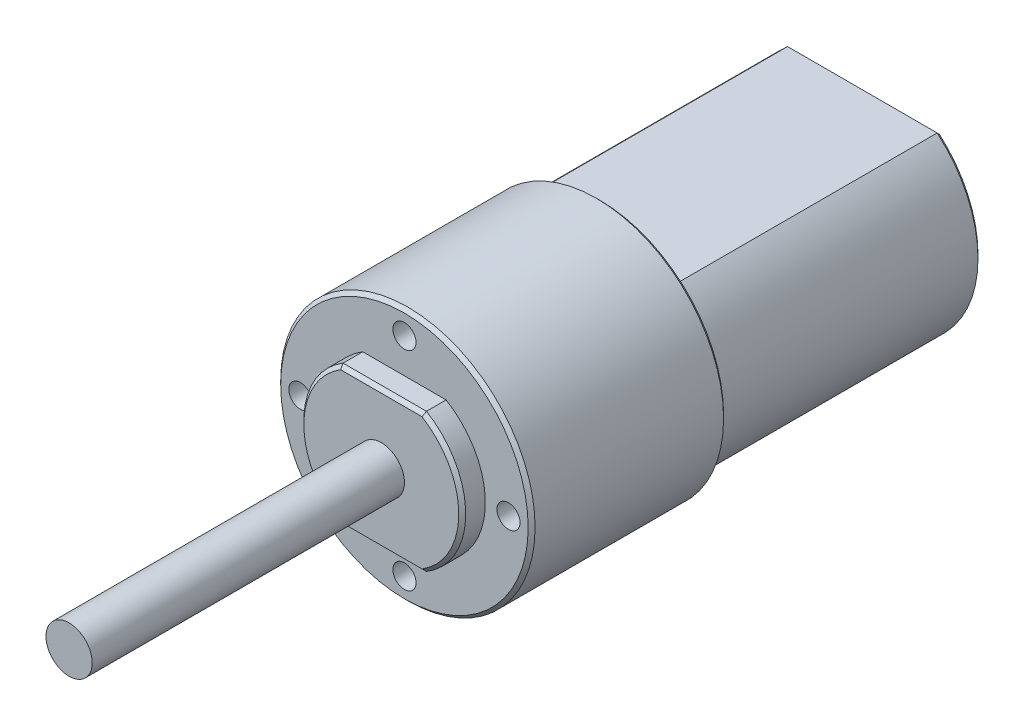
ISO-10303-21;
HEADER;
FILE_DESCRIPTION(('STEP AP214'),'2;1');
FILE_NAME('part.step','',(''),(''),'','','');
FILE_SCHEMA(('AUTOMOTIVE_DESIGN { 1 0 10303 214 1 1 1 1 }'));
ENDSEC;
DATA;
#1=APPLICATION_CONTEXT('core data for automotive mechanical design processes');
#2=APPLICATION_PROTOCOL_DEFINITION('international standard','automotive_design',2000,#1);
#3=PRODUCT_CONTEXT('',#1,'mechanical');
#4=PRODUCT('Part','Part','',(#3));
#5=PRODUCT_RELATED_PRODUCT_CATEGORY('part','',(#4));
#6=PRODUCT_DEFINITION_FORMATION('','',#4);
#7=PRODUCT_DEFINITION_CONTEXT('part definition',#1,'design');
#8=PRODUCT_DEFINITION('design','',#6,#7);
#9=PRODUCT_DEFINITION_SHAPE('','',#8);
#10=(LENGTH_UNIT() NAMED_UNIT(*) SI_UNIT(.MILLI.,.METRE.));
#11=(NAMED_UNIT(*) PLANE_ANGLE_UNIT() SI_UNIT($,.RADIAN.));
#12=(NAMED_UNIT(*) SI_UNIT($,.STERADIAN.) SOLID_ANGLE_UNIT());
#13=UNCERTAINTY_MEASURE_WITH_UNIT(LENGTH_MEASURE(1.E-05),#10,'distance_accuracy_value','');
#14=(GEOMETRIC_REPRESENTATION_CONTEXT(3) GLOBAL_UNCERTAINTY_ASSIGNED_CONTEXT((#13)) GLOBAL_UNIT_ASSIGNED_CONTEXT((#10,
#11,#12)) REPRESENTATION_CONTEXT('',''));
#15=CARTESIAN_POINT('',(0.,0.,0.));
#16=DIRECTION('',(0.,0.,1.));
#17=DIRECTION('',(1.,0.,0.));
#18=AXIS2_PLACEMENT_3D('',#15,#16,#17);
#19=CARTESIAN_POINT('',(-2.,0.,2.));
#20=DIRECTION('',(0.,0.,-1.));
#21=DIRECTION('',(-1.,0.,0.));
#22=AXIS2_PLACEMENT_3D('',#19,#20,#21);
#23=PLANE('',#22);
#24=DIRECTION('',(-1.,0.,0.));
#25=VECTOR('',#24,1.);
#26=CARTESIAN_POINT('',(-2.,5.70000000000001,2.));
#27=LINE('',#26,#25);
#28=CARTESIAN_POINT('',(3.5213633723318,5.70000000000001,2.));
#29=VERTEX_POINT('',#28);
#30=CARTESIAN_POINT('',(-3.5213633723318,5.70000000000001,2.));
#31=VERTEX_POINT('',#30);
#32=EDGE_CURVE('E213',#29,#31,#27,.T.);
#33=ORIENTED_EDGE('',*,*,#32,.T.);
#34=CARTESIAN_POINT('',(0.,0.,2.));
#35=DIRECTION('',(0.,0.,-1.));
#36=DIRECTION('',(-1.,0.,0.));
#37=AXIS2_PLACEMENT_3D('',#34,#35,#36);
#38=CIRCLE('',#37,6.7);
#39=CARTESIAN_POINT('',(-3.5213633723318,-5.70000000000001,2.));
#40=VERTEX_POINT('',#39);
#41=EDGE_CURVE('E222',#31,#40,#38,.F.);
#42=ORIENTED_EDGE('',*,*,#41,.T.);
#43=DIRECTION('',(1.,0.,0.));
#44=VECTOR('',#43,1.);
#45=CARTESIAN_POINT('',(3.60555127546399,-5.70000000000001,2.));
#46=LINE('',#45,#44);
#47=CARTESIAN_POINT('',(3.5213633723318,-5.70000000000001,2.));
#48=VERTEX_POINT('',#47);
#49=EDGE_CURVE('E219',#40,#48,#46,.T.);
#50=ORIENTED_EDGE('',*,*,#49,.T.);
#51=CARTESIAN_POINT('',(0.,0.,2.));
#52=DIRECTION('',(0.,0.,-1.));
#53=DIRECTION('',(-1.,0.,0.));
#54=AXIS2_PLACEMENT_3D('',#51,#52,#53);
#55=CIRCLE('',#54,6.7);
#56=EDGE_CURVE('E216',#48,#29,#55,.F.);
#57=ORIENTED_EDGE('',*,*,#56,.T.);
#58=EDGE_LOOP('',(#33,#42,#50,#57));
#59=FACE_BOUND('',#58,.T.);
#60=CARTESIAN_POINT('',(0.,0.,2.));
#61=DIRECTION('',(0.,0.,1.));
#62=DIRECTION('',(1.,0.,0.));
#63=AXIS2_PLACEMENT_3D('',#60,#61,#62);
#64=CIRCLE('',#63,2.);
#65=CARTESIAN_POINT('',(2.,0.,2.));
#66=VERTEX_POINT('',#65);
#67=EDGE_CURVE('E171',#66,#66,#64,.T.);
#68=ORIENTED_EDGE('',*,*,#67,.F.);
#69=EDGE_LOOP('',(#68));
#70=FACE_BOUND('',#69,.T.);
#71=ADVANCED_FACE('F45',(#59,#70),#23,.F.);
#72=CARTESIAN_POINT('',(0.,0.,-0.287466161081869));
#73=DIRECTION('',(0.,0.,1.));
#74=DIRECTION('',(1.,0.,0.));
#75=AXIS2_PLACEMENT_3D('',#72,#73,#74);
#76=CYLINDRICAL_SURFACE('',#75,7.);
#77=DIRECTION('',(0.,0.,1.));
#78=VECTOR('',#77,1.);
#79=CARTESIAN_POINT('',(3.60555127546399,6.,-7.28010988928052));
#80=LINE('',#79,#78);
#81=CARTESIAN_POINT('',(3.60555127546399,6.,0.));
#82=VERTEX_POINT('',#81);
#83=CARTESIAN_POINT('',(3.60555127546399,6.,1.7));
#84=VERTEX_POINT('',#83);
#85=EDGE_CURVE('E148',#82,#84,#80,.T.);
#86=ORIENTED_EDGE('',*,*,#85,.T.);
#87=CARTESIAN_POINT('',(0.,0.,1.7));
#88=DIRECTION('',(0.,0.,-1.));
#89=DIRECTION('',(-1.,0.,0.));
#90=AXIS2_PLACEMENT_3D('',#87,#88,#89);
#91=CIRCLE('',#90,7.);
#92=CARTESIAN_POINT('',(3.60555127546399,-6.,1.7));
#93=VERTEX_POINT('',#92);
#94=EDGE_CURVE('E77',#84,#93,#91,.T.);
#95=ORIENTED_EDGE('',*,*,#94,.T.);
#96=DIRECTION('',(0.,0.,1.));
#97=VECTOR('',#96,1.);
#98=CARTESIAN_POINT('',(3.60555127546399,-6.,-7.28010988928052));
#99=LINE('',#98,#97);
#100=CARTESIAN_POINT('',(3.60555127546399,-6.,0.));
#101=VERTEX_POINT('',#100);
#102=EDGE_CURVE('E365',#101,#93,#99,.T.);
#103=ORIENTED_EDGE('',*,*,#102,.F.);
#104=CARTESIAN_POINT('',(0.,0.,0.));
#105=DIRECTION('',(0.,0.,1.));
#106=DIRECTION('',(1.,0.,0.));
#107=AXIS2_PLACEMENT_3D('',#104,#105,#106);
#108=CIRCLE('',#107,7.);
#109=EDGE_CURVE('E172',#101,#82,#108,.T.);
#110=ORIENTED_EDGE('',*,*,#109,.T.);
#111=EDGE_LOOP('',(#86,#95,#103,#110));
#112=FACE_BOUND('',#111,.T.);
#113=ADVANCED_FACE('F453',(#112),#76,.T.);
#114=DIRECTION('',(0.,0.,1.));
#115=VECTOR('',#114,1.);
#116=CARTESIAN_POINT('',(-3.60555127546399,-6.,-7.28010988928052));
#117=LINE('',#116,#115);
#118=CARTESIAN_POINT('',(-3.60555127546399,-6.,0.));
#119=VERTEX_POINT('',#118);
#120=CARTESIAN_POINT('',(-3.60555127546399,-6.,1.7));
#121=VERTEX_POINT('',#120);
#122=EDGE_CURVE('E154',#119,#121,#117,.T.);
#123=ORIENTED_EDGE('',*,*,#122,.T.);
#124=CARTESIAN_POINT('',(0.,0.,1.7));
#125=DIRECTION('',(0.,0.,-1.));
#126=DIRECTION('',(-1.,0.,0.));
#127=AXIS2_PLACEMENT_3D('',#124,#125,#126);
#128=CIRCLE('',#127,7.);
#129=CARTESIAN_POINT('',(-3.60555127546399,6.,1.7));
#130=VERTEX_POINT('',#129);
#131=EDGE_CURVE('E163',#121,#130,#128,.T.);
#132=ORIENTED_EDGE('',*,*,#131,.T.);
#133=DIRECTION('',(0.,0.,1.));
#134=VECTOR('',#133,1.);
#135=CARTESIAN_POINT('',(-3.60555127546399,6.,-7.28010988928052));
#136=LINE('',#135,#134);
#137=CARTESIAN_POINT('',(-3.60555127546399,6.,0.));
#138=VERTEX_POINT('',#137);
#139=EDGE_CURVE('E147',#138,#130,#136,.T.);
#140=ORIENTED_EDGE('',*,*,#139,.F.);
#141=EDGE_CURVE('E161',#138,#119,#108,.T.);
#142=ORIENTED_EDGE('',*,*,#141,.T.);
#143=EDGE_LOOP('',(#123,#132,#140,#142));
#144=FACE_BOUND('',#143,.T.);
#145=ADVANCED_FACE('F160',(#144),#76,.T.);
#146=CARTESIAN_POINT('',(0.,0.,-0.287466161081869));
#147=DIRECTION('',(0.,0.,1.));
#148=DIRECTION('',(1.,0.,0.));
#149=AXIS2_PLACEMENT_3D('',#146,#147,#148);
#150=CYLINDRICAL_SURFACE('',#149,10.);
#151=DIRECTION('',(0.,0.,-1.));
#152=VECTOR('',#151,1.);
#153=CARTESIAN_POINT('',(6.46988214730377,-7.625,-3.74408403036869));
#154=LINE('',#153,#152);
#155=CARTESIAN_POINT('',(6.46988214730377,-7.625,-16.9));
#156=VERTEX_POINT('',#155);
#157=CARTESIAN_POINT('',(6.46988214730377,-7.625,-39.6));
#158=VERTEX_POINT('',#157);
#159=EDGE_CURVE('E409',#156,#158,#154,.T.);
#160=ORIENTED_EDGE('',*,*,#159,.T.);
#161=CARTESIAN_POINT('',(0.,0.,-39.6));
#162=DIRECTION('',(0.,0.,1.));
#163=DIRECTION('',(1.,0.,0.));
#164=AXIS2_PLACEMENT_3D('',#161,#162,#163);
#165=CIRCLE('',#164,10.);
#166=CARTESIAN_POINT('',(6.46988214730377,7.625,-39.6));
#167=VERTEX_POINT('',#166);
#168=EDGE_CURVE('E204',#158,#167,#165,.T.);
#169=ORIENTED_EDGE('',*,*,#168,.T.);
#170=DIRECTION('',(0.,0.,-1.));
#171=VECTOR('',#170,1.);
#172=CARTESIAN_POINT('',(6.46988214730377,7.625,-3.74408403036869));
#173=LINE('',#172,#171);
#174=CARTESIAN_POINT('',(6.46988214730377,7.625,-16.9));
#175=VERTEX_POINT('',#174);
#176=EDGE_CURVE('E413',#175,#167,#173,.T.);
#177=ORIENTED_EDGE('',*,*,#176,.F.);
#178=CARTESIAN_POINT('',(0.,0.,-16.9));
#179=DIRECTION('',(0.,0.,1.));
#180=DIRECTION('',(1.,0.,0.));
#181=AXIS2_PLACEMENT_3D('',#178,#179,#180);
#182=CIRCLE('',#181,10.);
#183=EDGE_CURVE('E181',#156,#175,#182,.T.);
#184=ORIENTED_EDGE('',*,*,#183,.F.);
#185=EDGE_LOOP('',(#160,#169,#177,#184));
#186=FACE_BOUND('',#185,.T.);
#187=ADVANCED_FACE('F427',(#186),#150,.T.);
#188=DIRECTION('',(0.,0.,-1.));
#189=VECTOR('',#188,1.);
#190=CARTESIAN_POINT('',(-6.46988214730377,7.625,-3.74408403036869));
#191=LINE('',#190,#189);
#192=CARTESIAN_POINT('',(-6.46988214730377,7.625,-16.9));
#193=VERTEX_POINT('',#192);
#194=CARTESIAN_POINT('',(-6.46988214730377,7.625,-39.6));
#195=VERTEX_POINT('',#194);
#196=EDGE_CURVE('E408',#193,#195,#191,.T.);
#197=ORIENTED_EDGE('',*,*,#196,.T.);
#198=CARTESIAN_POINT('',(0.,0.,-39.6));
#199=DIRECTION('',(0.,0.,1.));
#200=DIRECTION('',(1.,0.,0.));
#201=AXIS2_PLACEMENT_3D('',#198,#199,#200);
#202=CIRCLE('',#201,10.);
#203=CARTESIAN_POINT('',(-6.46988214730377,-7.625,-39.6));
#204=VERTEX_POINT('',#203);
#205=EDGE_CURVE('E210',#195,#204,#202,.T.);
#206=ORIENTED_EDGE('',*,*,#205,.T.);
#207=DIRECTION('',(0.,0.,-1.));
#208=VECTOR('',#207,1.);
#209=CARTESIAN_POINT('',(-6.46988214730377,-7.625,-3.74408403036869));
#210=LINE('',#209,#208);
#211=CARTESIAN_POINT('',(-6.46988214730377,-7.625,-16.9));
#212=VERTEX_POINT('',#211);
#213=EDGE_CURVE('E419',#212,#204,#210,.T.);
#214=ORIENTED_EDGE('',*,*,#213,.F.);
#215=EDGE_CURVE('E179',#193,#212,#182,.T.);
#216=ORIENTED_EDGE('',*,*,#215,.F.);
#217=EDGE_LOOP('',(#197,#206,#214,#216));
#218=FACE_BOUND('',#217,.T.);
#219=ADVANCED_FACE('F474',(#218),#150,.T.);
#220=CARTESIAN_POINT('',(-10.,0.,-39.9));
#221=DIRECTION('',(0.,0.,1.));
#222=DIRECTION('',(1.,0.,0.));
#223=AXIS2_PLACEMENT_3D('',#220,#221,#222);
#224=PLANE('',#223);
#225=CARTESIAN_POINT('',(0.,0.,-39.9));
#226=DIRECTION('',(0.,0.,1.));
#227=DIRECTION('',(1.,0.,0.));
#228=AXIS2_PLACEMENT_3D('',#225,#226,#227);
#229=CIRCLE('',#228,9.70000000000001);
#230=CARTESIAN_POINT('',(6.35880295338675,7.32500000000001,-39.9));
#231=VERTEX_POINT('',#230);
#232=CARTESIAN_POINT('',(6.35880295338675,-7.32500000000001,-39.9));
#233=VERTEX_POINT('',#232);
#234=EDGE_CURVE('E193',#231,#233,#229,.F.);
#235=ORIENTED_EDGE('',*,*,#234,.T.);
#236=DIRECTION('',(-1.,0.,0.));
#237=VECTOR('',#236,1.);
#238=CARTESIAN_POINT('',(-6.46988214730377,-7.32500000000001,-39.9));
#239=LINE('',#238,#237);
#240=CARTESIAN_POINT('',(-6.35880295338675,-7.32500000000001,-39.9));
#241=VERTEX_POINT('',#240);
#242=EDGE_CURVE('E196',#233,#241,#239,.T.);
#243=ORIENTED_EDGE('',*,*,#242,.T.);
#244=CARTESIAN_POINT('',(0.,0.,-39.9));
#245=DIRECTION('',(0.,0.,1.));
#246=DIRECTION('',(1.,0.,0.));
#247=AXIS2_PLACEMENT_3D('',#244,#245,#246);
#248=CIRCLE('',#247,9.70000000000001);
#249=CARTESIAN_POINT('',(-6.35880295338675,7.32500000000001,-39.9));
#250=VERTEX_POINT('',#249);
#251=EDGE_CURVE('E187',#241,#250,#248,.F.);
#252=ORIENTED_EDGE('',*,*,#251,.T.);
#253=DIRECTION('',(1.,0.,0.));
#254=VECTOR('',#253,1.);
#255=CARTESIAN_POINT('',(-10.,7.32500000000001,-39.9));
#256=LINE('',#255,#254);
#257=EDGE_CURVE('E190',#250,#231,#256,.T.);
#258=ORIENTED_EDGE('',*,*,#257,.T.);
#259=EDGE_LOOP('',(#235,#243,#252,#258));
#260=FACE_BOUND('',#259,.T.);
#261=ADVANCED_FACE('F445',(#260),#224,.F.);
#262=CARTESIAN_POINT('',(-2.,0.,29.));
#263=DIRECTION('',(0.,0.,-1.));
#264=DIRECTION('',(-1.,0.,0.));
#265=AXIS2_PLACEMENT_3D('',#262,#263,#264);
#266=PLANE('',#265);
#267=CARTESIAN_POINT('',(0.,0.,29.));
#268=DIRECTION('',(0.,0.,1.));
#269=DIRECTION('',(1.,0.,0.));
#270=AXIS2_PLACEMENT_3D('',#267,#268,#269);
#271=CIRCLE('',#270,2.);
#272=CARTESIAN_POINT('',(2.,0.,29.));
#273=VERTEX_POINT('',#272);
#274=EDGE_CURVE('E177',#273,#273,#271,.T.);
#275=ORIENTED_EDGE('',*,*,#274,.T.);
#276=EDGE_LOOP('',(#275));
#277=FACE_BOUND('',#276,.T.);
#278=ADVANCED_FACE('F467',(#277),#266,.F.);
#279=CARTESIAN_POINT('',(0.,0.,-0.287466161081869));
#280=DIRECTION('',(0.,0.,1.));
#281=DIRECTION('',(1.,0.,0.));
#282=AXIS2_PLACEMENT_3D('',#279,#280,#281);
#283=CYLINDRICAL_SURFACE('',#282,2.);
#284=ORIENTED_EDGE('',*,*,#274,.F.);
#285=EDGE_LOOP('',(#284));
#286=FACE_BOUND('',#285,.T.);
#287=ORIENTED_EDGE('',*,*,#67,.T.);
#288=EDGE_LOOP('',(#287));
#289=FACE_BOUND('',#288,.T.);
#290=ADVANCED_FACE('F465',(#286,#289),#283,.T.);
#291=CARTESIAN_POINT('',(-7.,0.,0.));
#292=DIRECTION('',(0.,0.,-1.));
#293=DIRECTION('',(-1.,0.,0.));
#294=AXIS2_PLACEMENT_3D('',#291,#292,#293);
#295=PLANE('',#294);
#296=CARTESIAN_POINT('',(0.,0.,0.));
#297=DIRECTION('',(0.,0.,-1.));
#298=DIRECTION('',(-1.,0.,0.));
#299=AXIS2_PLACEMENT_3D('',#296,#297,#298);
#300=CIRCLE('',#299,10.7);
#301=CARTESIAN_POINT('',(-10.7,0.,0.));
#302=VERTEX_POINT('',#301);
#303=EDGE_CURVE('E235',#302,#302,#300,.F.);
#304=ORIENTED_EDGE('',*,*,#303,.T.);
#305=EDGE_LOOP('',(#304));
#306=FACE_BOUND('',#305,.T.);
#307=CARTESIAN_POINT('',(0.,9.,0.));
#308=DIRECTION('',(0.,0.,1.));
#309=DIRECTION('',(1.,0.,0.));
#310=AXIS2_PLACEMENT_3D('',#307,#308,#309);
#311=CIRCLE('',#310,1.);
#312=CARTESIAN_POINT('',(1.,9.,0.));
#313=VERTEX_POINT('',#312);
#314=EDGE_CURVE('E377',#313,#313,#311,.T.);
#315=ORIENTED_EDGE('',*,*,#314,.F.);
#316=EDGE_LOOP('',(#315));
#317=FACE_BOUND('',#316,.T.);
#318=CARTESIAN_POINT('',(9.,0.,0.));
#319=DIRECTION('',(0.,0.,1.));
#320=DIRECTION('',(1.,0.,0.));
#321=AXIS2_PLACEMENT_3D('',#318,#319,#320);
#322=CIRCLE('',#321,1.);
#323=CARTESIAN_POINT('',(10.,0.,0.));
#324=VERTEX_POINT('',#323);
#325=EDGE_CURVE('E381',#324,#324,#322,.T.);
#326=ORIENTED_EDGE('',*,*,#325,.F.);
#327=EDGE_LOOP('',(#326));
#328=FACE_BOUND('',#327,.T.);
#329=CARTESIAN_POINT('',(0.,-9.,0.));
#330=DIRECTION('',(0.,0.,1.));
#331=DIRECTION('',(1.,0.,0.));
#332=AXIS2_PLACEMENT_3D('',#329,#330,#331);
#333=CIRCLE('',#332,1.);
#334=CARTESIAN_POINT('',(1.,-9.,0.));
#335=VERTEX_POINT('',#334);
#336=EDGE_CURVE('E389',#335,#335,#333,.T.);
#337=ORIENTED_EDGE('',*,*,#336,.F.);
#338=EDGE_LOOP('',(#337));
#339=FACE_BOUND('',#338,.T.);
#340=CARTESIAN_POINT('',(-9.,0.,0.));
#341=DIRECTION('',(0.,0.,1.));
#342=DIRECTION('',(1.,0.,0.));
#343=AXIS2_PLACEMENT_3D('',#340,#341,#342);
#344=CIRCLE('',#343,1.);
#345=CARTESIAN_POINT('',(-8.,0.,0.));
#346=VERTEX_POINT('',#345);
#347=EDGE_CURVE('E397',#346,#346,#344,.T.);
#348=ORIENTED_EDGE('',*,*,#347,.F.);
#349=EDGE_LOOP('',(#348));
#350=FACE_BOUND('',#349,.T.);
#351=ORIENTED_EDGE('',*,*,#141,.F.);
#352=DIRECTION('',(1.,0.,0.));
#353=VECTOR('',#352,1.);
#354=CARTESIAN_POINT('',(0.,6.,0.));
#355=LINE('',#354,#353);
#356=EDGE_CURVE('E144',#138,#82,#355,.T.);
#357=ORIENTED_EDGE('',*,*,#356,.T.);
#358=ORIENTED_EDGE('',*,*,#109,.F.);
#359=DIRECTION('',(1.,0.,0.));
#360=VECTOR('',#359,1.);
#361=CARTESIAN_POINT('',(0.,-6.,0.));
#362=LINE('',#361,#360);
#363=EDGE_CURVE('E169',#119,#101,#362,.T.);
#364=ORIENTED_EDGE('',*,*,#363,.F.);
#365=EDGE_LOOP('',(#351,#357,#358,#364));
#366=FACE_BOUND('',#365,.T.);
#367=ADVANCED_FACE('F168',(#306,#317,#328,#339,#350,#366),#295,.F.);
#368=CARTESIAN_POINT('',(0.,0.,-0.287466161081869));
#369=DIRECTION('',(0.,0.,1.));
#370=DIRECTION('',(1.,0.,0.));
#371=AXIS2_PLACEMENT_3D('',#368,#369,#370);
#372=CYLINDRICAL_SURFACE('',#371,11.);
#373=CARTESIAN_POINT('',(0.,0.,-0.299999999999999));
#374=DIRECTION('',(0.,0.,-1.));
#375=DIRECTION('',(-1.,0.,0.));
#376=AXIS2_PLACEMENT_3D('',#373,#374,#375);
#377=CIRCLE('',#376,11.);
#378=CARTESIAN_POINT('',(-11.,0.,-0.299999999999999));
#379=VERTEX_POINT('',#378);
#380=EDGE_CURVE('E62',#379,#379,#377,.T.);
#381=ORIENTED_EDGE('',*,*,#380,.T.);
#382=EDGE_LOOP('',(#381));
#383=FACE_BOUND('',#382,.T.);
#384=CARTESIAN_POINT('',(0.,0.,-16.6));
#385=DIRECTION('',(0.,0.,1.));
#386=DIRECTION('',(1.,0.,0.));
#387=AXIS2_PLACEMENT_3D('',#384,#385,#386);
#388=CIRCLE('',#387,11.);
#389=CARTESIAN_POINT('',(11.,0.,-16.6));
#390=VERTEX_POINT('',#389);
#391=EDGE_CURVE('E239',#390,#390,#388,.T.);
#392=ORIENTED_EDGE('',*,*,#391,.T.);
#393=EDGE_LOOP('',(#392));
#394=FACE_BOUND('',#393,.T.);
#395=ADVANCED_FACE('F491',(#383,#394),#372,.T.);
#396=CARTESIAN_POINT('',(-11.,0.,-16.9));
#397=DIRECTION('',(0.,0.,1.));
#398=DIRECTION('',(1.,0.,0.));
#399=AXIS2_PLACEMENT_3D('',#396,#397,#398);
#400=PLANE('',#399);
#401=CARTESIAN_POINT('',(0.,0.,-16.9));
#402=DIRECTION('',(0.,0.,1.));
#403=DIRECTION('',(1.,0.,0.));
#404=AXIS2_PLACEMENT_3D('',#401,#402,#403);
#405=CIRCLE('',#404,10.7);
#406=CARTESIAN_POINT('',(10.7,0.,-16.9));
#407=VERTEX_POINT('',#406);
#408=EDGE_CURVE('E11',#407,#407,#405,.F.);
#409=ORIENTED_EDGE('',*,*,#408,.T.);
#410=EDGE_LOOP('',(#409));
#411=FACE_BOUND('',#410,.T.);
#412=ORIENTED_EDGE('',*,*,#183,.T.);
#413=DIRECTION('',(-1.,0.,0.));
#414=VECTOR('',#413,1.);
#415=CARTESIAN_POINT('',(0.,7.625,-16.9));
#416=LINE('',#415,#414);
#417=EDGE_CURVE('E404',#175,#193,#416,.T.);
#418=ORIENTED_EDGE('',*,*,#417,.T.);
#419=ORIENTED_EDGE('',*,*,#215,.T.);
#420=DIRECTION('',(-1.,0.,0.));
#421=VECTOR('',#420,1.);
#422=CARTESIAN_POINT('',(0.,-7.625,-16.9));
#423=LINE('',#422,#421);
#424=EDGE_CURVE('E376',#156,#212,#423,.T.);
#425=ORIENTED_EDGE('',*,*,#424,.F.);
#426=EDGE_LOOP('',(#412,#418,#419,#425));
#427=FACE_BOUND('',#426,.T.);
#428=ADVANCED_FACE('F489',(#411,#427),#400,.F.);
#429=CARTESIAN_POINT('',(0.,-7.625,-3.74408403036869));
#430=DIRECTION('',(0.,-1.,0.));
#431=DIRECTION('',(0.,0.,-1.));
#432=AXIS2_PLACEMENT_3D('',#429,#430,#431);
#433=PLANE('',#432);
#434=ORIENTED_EDGE('',*,*,#213,.T.);
#435=DIRECTION('',(1.,0.,0.));
#436=VECTOR('',#435,1.);
#437=CARTESIAN_POINT('',(6.46988214730377,-7.625,-39.6));
#438=LINE('',#437,#436);
#439=EDGE_CURVE('E200',#204,#158,#438,.T.);
#440=ORIENTED_EDGE('',*,*,#439,.T.);
#441=ORIENTED_EDGE('',*,*,#159,.F.);
#442=ORIENTED_EDGE('',*,*,#424,.T.);
#443=EDGE_LOOP('',(#434,#440,#441,#442));
#444=FACE_BOUND('',#443,.T.);
#445=ADVANCED_FACE('F432',(#444),#433,.T.);
#446=CARTESIAN_POINT('',(0.,7.625,-3.74408403036869));
#447=DIRECTION('',(0.,-1.,0.));
#448=DIRECTION('',(0.,0.,-1.));
#449=AXIS2_PLACEMENT_3D('',#446,#447,#448);
#450=PLANE('',#449);
#451=ORIENTED_EDGE('',*,*,#176,.T.);
#452=DIRECTION('',(-1.,0.,0.));
#453=VECTOR('',#452,1.);
#454=CARTESIAN_POINT('',(0.,7.625,-39.6));
#455=LINE('',#454,#453);
#456=EDGE_CURVE('E207',#167,#195,#455,.T.);
#457=ORIENTED_EDGE('',*,*,#456,.T.);
#458=ORIENTED_EDGE('',*,*,#196,.F.);
#459=ORIENTED_EDGE('',*,*,#417,.F.);
#460=EDGE_LOOP('',(#451,#457,#458,#459));
#461=FACE_BOUND('',#460,.T.);
#462=ADVANCED_FACE('F518',(#461),#450,.F.);
#463=CARTESIAN_POINT('',(-9.,0.,-10.));
#464=DIRECTION('',(0.,0.,1.));
#465=DIRECTION('',(1.,0.,0.));
#466=AXIS2_PLACEMENT_3D('',#463,#464,#465);
#467=CYLINDRICAL_SURFACE('',#466,1.);
#468=CARTESIAN_POINT('',(-9.,0.,-10.));
#469=DIRECTION('',(0.,0.,1.));
#470=DIRECTION('',(1.,0.,0.));
#471=AXIS2_PLACEMENT_3D('',#468,#469,#470);
#472=CIRCLE('',#471,1.);
#473=CARTESIAN_POINT('',(-8.,0.,-10.));
#474=VERTEX_POINT('',#473);
#475=EDGE_CURVE('E165',#474,#474,#472,.T.);
#476=ORIENTED_EDGE('',*,*,#475,.F.);
#477=EDGE_LOOP('',(#476));
#478=FACE_BOUND('',#477,.T.);
#479=ORIENTED_EDGE('',*,*,#347,.T.);
#480=EDGE_LOOP('',(#479));
#481=FACE_BOUND('',#480,.T.);
#482=ADVANCED_FACE('F520',(#478,#481),#467,.F.);
#483=CARTESIAN_POINT('',(-9.,0.,-10.));
#484=DIRECTION('',(0.,0.,1.));
#485=DIRECTION('',(1.,0.,0.));
#486=AXIS2_PLACEMENT_3D('',#483,#484,#485);
#487=PLANE('',#486);
#488=ORIENTED_EDGE('',*,*,#475,.T.);
#489=EDGE_LOOP('',(#488));
#490=FACE_BOUND('',#489,.T.);
#491=ADVANCED_FACE('F525',(#490),#487,.T.);
#492=CARTESIAN_POINT('',(0.,-9.,-10.));
#493=DIRECTION('',(0.,0.,1.));
#494=DIRECTION('',(1.,0.,0.));
#495=AXIS2_PLACEMENT_3D('',#492,#493,#494);
#496=CYLINDRICAL_SURFACE('',#495,1.);
#497=CARTESIAN_POINT('',(0.,-9.,-10.));
#498=DIRECTION('',(0.,0.,1.));
#499=DIRECTION('',(1.,0.,0.));
#500=AXIS2_PLACEMENT_3D('',#497,#498,#499);
#501=CIRCLE('',#500,1.);
#502=CARTESIAN_POINT('',(1.,-9.,-10.));
#503=VERTEX_POINT('',#502);
#504=EDGE_CURVE('E393',#503,#503,#501,.T.);
#505=ORIENTED_EDGE('',*,*,#504,.F.);
#506=EDGE_LOOP('',(#505));
#507=FACE_BOUND('',#506,.T.);
#508=ORIENTED_EDGE('',*,*,#336,.T.);
#509=EDGE_LOOP('',(#508));
#510=FACE_BOUND('',#509,.T.);
#511=ADVANCED_FACE('F530',(#507,#510),#496,.F.);
#512=CARTESIAN_POINT('',(0.,-9.,-10.));
#513=DIRECTION('',(0.,0.,1.));
#514=DIRECTION('',(1.,0.,0.));
#515=AXIS2_PLACEMENT_3D('',#512,#513,#514);
#516=PLANE('',#515);
#517=ORIENTED_EDGE('',*,*,#504,.T.);
#518=EDGE_LOOP('',(#517));
#519=FACE_BOUND('',#518,.T.);
#520=ADVANCED_FACE('F533',(#519),#516,.T.);
#521=CARTESIAN_POINT('',(9.,0.,-10.));
#522=DIRECTION('',(0.,0.,1.));
#523=DIRECTION('',(1.,0.,0.));
#524=AXIS2_PLACEMENT_3D('',#521,#522,#523);
#525=CYLINDRICAL_SURFACE('',#524,1.);
#526=CARTESIAN_POINT('',(9.,0.,-10.));
#527=DIRECTION('',(0.,0.,1.));
#528=DIRECTION('',(1.,0.,0.));
#529=AXIS2_PLACEMENT_3D('',#526,#527,#528);
#530=CIRCLE('',#529,1.);
#531=CARTESIAN_POINT('',(10.,0.,-10.));
#532=VERTEX_POINT('',#531);
#533=EDGE_CURVE('E385',#532,#532,#530,.T.);
#534=ORIENTED_EDGE('',*,*,#533,.F.);
#535=EDGE_LOOP('',(#534));
#536=FACE_BOUND('',#535,.T.);
#537=ORIENTED_EDGE('',*,*,#325,.T.);
#538=EDGE_LOOP('',(#537));
#539=FACE_BOUND('',#538,.T.);
#540=ADVANCED_FACE('F536',(#536,#539),#525,.F.);
#541=CARTESIAN_POINT('',(9.,0.,-10.));
#542=DIRECTION('',(0.,0.,1.));
#543=DIRECTION('',(1.,0.,0.));
#544=AXIS2_PLACEMENT_3D('',#541,#542,#543);
#545=PLANE('',#544);
#546=ORIENTED_EDGE('',*,*,#533,.T.);
#547=EDGE_LOOP('',(#546));
#548=FACE_BOUND('',#547,.T.);
#549=ADVANCED_FACE('F541',(#548),#545,.T.);
#550=CARTESIAN_POINT('',(0.,9.,-10.));
#551=DIRECTION('',(0.,0.,1.));
#552=DIRECTION('',(1.,0.,0.));
#553=AXIS2_PLACEMENT_3D('',#550,#551,#552);
#554=CYLINDRICAL_SURFACE('',#553,1.);
#555=CARTESIAN_POINT('',(0.,9.,-10.));
#556=DIRECTION('',(0.,0.,1.));
#557=DIRECTION('',(1.,0.,0.));
#558=AXIS2_PLACEMENT_3D('',#555,#556,#557);
#559=CIRCLE('',#558,1.);
#560=CARTESIAN_POINT('',(1.,9.,-10.));
#561=VERTEX_POINT('',#560);
#562=EDGE_CURVE('E372',#561,#561,#559,.T.);
#563=ORIENTED_EDGE('',*,*,#562,.F.);
#564=EDGE_LOOP('',(#563));
#565=FACE_BOUND('',#564,.T.);
#566=ORIENTED_EDGE('',*,*,#314,.T.);
#567=EDGE_LOOP('',(#566));
#568=FACE_BOUND('',#567,.T.);
#569=ADVANCED_FACE('F544',(#565,#568),#554,.F.);
#570=CARTESIAN_POINT('',(0.,9.,-10.));
#571=DIRECTION('',(0.,0.,1.));
#572=DIRECTION('',(1.,0.,0.));
#573=AXIS2_PLACEMENT_3D('',#570,#571,#572);
#574=PLANE('',#573);
#575=ORIENTED_EDGE('',*,*,#562,.T.);
#576=EDGE_LOOP('',(#575));
#577=FACE_BOUND('',#576,.T.);
#578=ADVANCED_FACE('F551',(#577),#574,.T.);
#579=CARTESIAN_POINT('',(0.,-6.,-7.28010988928052));
#580=DIRECTION('',(0.,-1.,0.));
#581=DIRECTION('',(0.,0.,-1.));
#582=AXIS2_PLACEMENT_3D('',#579,#580,#581);
#583=PLANE('',#582);
#584=ORIENTED_EDGE('',*,*,#102,.T.);
#585=DIRECTION('',(-1.,0.,0.));
#586=VECTOR('',#585,1.);
#587=CARTESIAN_POINT('',(-3.60555127546399,-6.,1.7));
#588=LINE('',#587,#586);
#589=EDGE_CURVE('E228',#93,#121,#588,.T.);
#590=ORIENTED_EDGE('',*,*,#589,.T.);
#591=ORIENTED_EDGE('',*,*,#122,.F.);
#592=ORIENTED_EDGE('',*,*,#363,.T.);
#593=EDGE_LOOP('',(#584,#590,#591,#592));
#594=FACE_BOUND('',#593,.T.);
#595=ADVANCED_FACE('F364',(#594),#583,.T.);
#596=CARTESIAN_POINT('',(0.,6.,-7.28010988928052));
#597=DIRECTION('',(0.,-1.,0.));
#598=DIRECTION('',(0.,0.,-1.));
#599=AXIS2_PLACEMENT_3D('',#596,#597,#598);
#600=PLANE('',#599);
#601=ORIENTED_EDGE('',*,*,#139,.T.);
#602=DIRECTION('',(1.,0.,0.));
#603=VECTOR('',#602,1.);
#604=CARTESIAN_POINT('',(0.,6.,1.7));
#605=LINE('',#604,#603);
#606=EDGE_CURVE('E70',#130,#84,#605,.T.);
#607=ORIENTED_EDGE('',*,*,#606,.T.);
#608=ORIENTED_EDGE('',*,*,#85,.F.);
#609=ORIENTED_EDGE('',*,*,#356,.F.);
#610=EDGE_LOOP('',(#601,#607,#608,#609));
#611=FACE_BOUND('',#610,.T.);
#612=ADVANCED_FACE('F146',(#611),#600,.F.);
#613=CARTESIAN_POINT('',(0.,7.625,-39.6));
#614=DIRECTION('',(0.,-0.70710678118655,0.707106781186545));
#615=DIRECTION('',(-1.,0.,0.));
#616=AXIS2_PLACEMENT_3D('',#613,#614,#615);
#617=PLANE('',#616);
#618=CARTESIAN_POINT('',(-6.46988214730377,7.625,-39.6));
#619=CARTESIAN_POINT('',(-6.45151896235819,7.57497222851768,-39.6500277714823));
#620=CARTESIAN_POINT('',(-6.43308077055222,7.52495834320467,-39.7000416567953));
#621=CARTESIAN_POINT('',(-6.39605437258503,7.42495834320372,-39.8000416567963));
#622=CARTESIAN_POINT('',(-6.37746616641866,7.37497222851673,-39.8500277714833));
#623=CARTESIAN_POINT('',(-6.35880295338675,7.32500000000001,-39.9));
#624=B_SPLINE_CURVE_WITH_KNOTS('',3,(#618,#619,#620,#621,#622,#623),.UNSPECIFIED.,.F.,.F.,(4,2,
4),(0.,0.219282236598203,0.438564480711504),.UNSPECIFIED.);
#625=EDGE_CURVE('E297',#195,#250,#624,.T.);
#626=ORIENTED_EDGE('',*,*,#625,.F.);
#627=ORIENTED_EDGE('',*,*,#456,.F.);
#628=CARTESIAN_POINT('',(6.46988214730377,7.625,-39.6));
#629=CARTESIAN_POINT('',(6.45151896235819,7.57497222851768,-39.6500277714823));
#630=CARTESIAN_POINT('',(6.43308077055222,7.52495834320467,-39.7000416567953));
#631=CARTESIAN_POINT('',(6.39605437258503,7.42495834320372,-39.8000416567963));
#632=CARTESIAN_POINT('',(6.37746616641866,7.37497222851673,-39.8500277714833));
#633=CARTESIAN_POINT('',(6.35880295338675,7.32500000000001,-39.9));
#634=B_SPLINE_CURVE_WITH_KNOTS('',3,(#628,#629,#630,#631,#632,#633),.UNSPECIFIED.,.F.,.F.,(4,2,
4),(0.,0.219282236598203,0.438564480711504),.UNSPECIFIED.);
#635=EDGE_CURVE('E289',#231,#167,#634,.F.);
#636=ORIENTED_EDGE('',*,*,#635,.F.);
#637=ORIENTED_EDGE('',*,*,#257,.F.);
#638=EDGE_LOOP('',(#626,#627,#636,#637));
#639=FACE_BOUND('',#638,.T.);
#640=ADVANCED_FACE('F283',(#639),#617,.F.);
#641=CARTESIAN_POINT('',(0.,0.,-39.6));
#642=DIRECTION('',(0.,0.,1.));
#643=DIRECTION('',(1.,0.,0.));
#644=AXIS2_PLACEMENT_3D('',#641,#642,#643);
#645=CONICAL_SURFACE('',#644,10.,0.785398163397445);
#646=ORIENTED_EDGE('',*,*,#635,.T.);
#647=ORIENTED_EDGE('',*,*,#168,.F.);
#648=CARTESIAN_POINT('',(6.46988214730377,-7.625,-39.6));
#649=CARTESIAN_POINT('',(6.45151896235819,-7.57497222851768,-39.6500277714823));
#650=CARTESIAN_POINT('',(6.43308077055222,-7.52495834320467,-39.7000416567953));
#651=CARTESIAN_POINT('',(6.39605437258503,-7.42495834320372,-39.8000416567963));
#652=CARTESIAN_POINT('',(6.37746616641866,-7.37497222851673,-39.8500277714833));
#653=CARTESIAN_POINT('',(6.35880295338675,-7.32500000000001,-39.9));
#654=B_SPLINE_CURVE_WITH_KNOTS('',3,(#648,#649,#650,#651,#652,#653),.UNSPECIFIED.,.F.,.F.,(4,2,
4),(0.,0.219282236598203,0.438564480711504),.UNSPECIFIED.);
#655=EDGE_CURVE('E255',#233,#158,#654,.F.);
#656=ORIENTED_EDGE('',*,*,#655,.F.);
#657=ORIENTED_EDGE('',*,*,#234,.F.);
#658=EDGE_LOOP('',(#646,#647,#656,#657));
#659=FACE_BOUND('',#658,.T.);
#660=ADVANCED_FACE('F275',(#659),#645,.T.);
#661=CARTESIAN_POINT('',(0.,0.,-39.6));
#662=DIRECTION('',(0.,0.,1.));
#663=DIRECTION('',(1.,0.,0.));
#664=AXIS2_PLACEMENT_3D('',#661,#662,#663);
#665=CONICAL_SURFACE('',#664,10.,0.785398163397445);
#666=ORIENTED_EDGE('',*,*,#625,.T.);
#667=ORIENTED_EDGE('',*,*,#251,.F.);
#668=CARTESIAN_POINT('',(-6.35880295338675,-7.32500000000001,-39.9));
#669=CARTESIAN_POINT('',(-6.37746616641866,-7.37497222851673,-39.8500277714833));
#670=CARTESIAN_POINT('',(-6.39605437258503,-7.42495834320372,-39.8000416567963));
#671=CARTESIAN_POINT('',(-6.43308077055223,-7.52495834320467,-39.7000416567953));
#672=CARTESIAN_POINT('',(-6.45151896235819,-7.57497222851767,-39.6500277714823));
#673=CARTESIAN_POINT('',(-6.46988214730377,-7.625,-39.6));
#674=B_SPLINE_CURVE_WITH_KNOTS('',3,(#668,#669,#670,#671,#672,#673),.UNSPECIFIED.,.F.,.F.,(4,2,
4),(0.,0.219282244113302,0.438564480711503),.UNSPECIFIED.);
#675=EDGE_CURVE('E246',#204,#241,#674,.F.);
#676=ORIENTED_EDGE('',*,*,#675,.F.);
#677=ORIENTED_EDGE('',*,*,#205,.F.);
#678=EDGE_LOOP('',(#666,#667,#676,#677));
#679=FACE_BOUND('',#678,.T.);
#680=ADVANCED_FACE('F263',(#679),#665,.T.);
#681=CARTESIAN_POINT('',(-10.,-7.32500000000001,-39.9));
#682=DIRECTION('',(0.,-0.70710678118655,-0.707106781186545));
#683=DIRECTION('',(1.,0.,0.));
#684=AXIS2_PLACEMENT_3D('',#681,#682,#683);
#685=PLANE('',#684);
#686=ORIENTED_EDGE('',*,*,#655,.T.);
#687=ORIENTED_EDGE('',*,*,#439,.F.);
#688=ORIENTED_EDGE('',*,*,#675,.T.);
#689=ORIENTED_EDGE('',*,*,#242,.F.);
#690=EDGE_LOOP('',(#686,#687,#688,#689));
#691=FACE_BOUND('',#690,.T.);
#692=ADVANCED_FACE('F267',(#691),#685,.T.);
#693=CARTESIAN_POINT('',(0.,0.,2.));
#694=DIRECTION('',(0.,0.,-1.));
#695=DIRECTION('',(-1.,0.,0.));
#696=AXIS2_PLACEMENT_3D('',#693,#694,#695);
#697=CONICAL_SURFACE('',#696,6.70000000000001,0.785398163397448);
#698=CARTESIAN_POINT('',(3.5213633723318,-5.70000000000001,2.));
#699=CARTESIAN_POINT('',(3.53555415295883,-5.74997762662614,1.95002237337386));
#700=CARTESIAN_POINT('',(3.54966520205981,-5.7999664406356,1.9000335593644));
#701=CARTESIAN_POINT('',(3.57772783642832,-5.89996644063684,1.80003355936316));
#702=CARTESIAN_POINT('',(3.59167942170474,-5.94997762662739,1.75002237337262));
#703=CARTESIAN_POINT('',(3.60555127546399,-6.,1.7));
#704=B_SPLINE_CURVE_WITH_KNOTS('',3,(#698,#699,#700,#701,#702,#703),.UNSPECIFIED.,.F.,.F.,(4,2,
4),(0.,0.216268265887225,0.432536519731328),.UNSPECIFIED.);
#705=EDGE_CURVE('E343',#93,#48,#704,.F.);
#706=ORIENTED_EDGE('',*,*,#705,.F.);
#707=ORIENTED_EDGE('',*,*,#94,.F.);
#708=CARTESIAN_POINT('',(3.5213633723318,5.70000000000001,2.));
#709=CARTESIAN_POINT('',(3.53555415295883,5.74997762662614,1.95002237337386));
#710=CARTESIAN_POINT('',(3.54966520205981,5.7999664406356,1.9000335593644));
#711=CARTESIAN_POINT('',(3.57772783642832,5.89996644063684,1.80003355936316));
#712=CARTESIAN_POINT('',(3.59167942170474,5.94997762662739,1.75002237337262));
#713=CARTESIAN_POINT('',(3.60555127546399,6.,1.7));
#714=B_SPLINE_CURVE_WITH_KNOTS('',3,(#708,#709,#710,#711,#712,#713),.UNSPECIFIED.,.F.,.F.,(4,2,
4),(0.,0.216268265887225,0.432536519731328),.UNSPECIFIED.);
#715=EDGE_CURVE('E50',#29,#84,#714,.T.);
#716=ORIENTED_EDGE('',*,*,#715,.F.);
#717=ORIENTED_EDGE('',*,*,#56,.F.);
#718=EDGE_LOOP('',(#706,#707,#716,#717));
#719=FACE_BOUND('',#718,.T.);
#720=ADVANCED_FACE('F273',(#719),#697,.T.);
#721=CARTESIAN_POINT('',(0.,6.,1.7));
#722=DIRECTION('',(0.,-0.707106781186547,-0.707106781186547));
#723=DIRECTION('',(1.,0.,0.));
#724=AXIS2_PLACEMENT_3D('',#721,#722,#723);
#725=PLANE('',#724);
#726=ORIENTED_EDGE('',*,*,#715,.T.);
#727=ORIENTED_EDGE('',*,*,#606,.F.);
#728=CARTESIAN_POINT('',(-3.60555127546399,6.,1.7));
#729=CARTESIAN_POINT('',(-3.59167942170474,5.94997762662739,1.75002237337262));
#730=CARTESIAN_POINT('',(-3.57772783642832,5.89996644063684,1.80003355936316));
#731=CARTESIAN_POINT('',(-3.54966520205981,5.7999664406356,1.9000335593644));
#732=CARTESIAN_POINT('',(-3.53555415295883,5.74997762662614,1.95002237337386));
#733=CARTESIAN_POINT('',(-3.5213633723318,5.70000000000001,2.));
#734=B_SPLINE_CURVE_WITH_KNOTS('',3,(#728,#729,#730,#731,#732,#733),.UNSPECIFIED.,.F.,.F.,(4,2,
4),(0.,0.216268253844103,0.432536519731328),.UNSPECIFIED.);
#735=EDGE_CURVE('E310',#31,#130,#734,.F.);
#736=ORIENTED_EDGE('',*,*,#735,.F.);
#737=ORIENTED_EDGE('',*,*,#32,.F.);
#738=EDGE_LOOP('',(#726,#727,#736,#737));
#739=FACE_BOUND('',#738,.T.);
#740=ADVANCED_FACE('F327',(#739),#725,.F.);
#741=CARTESIAN_POINT('',(-2.,-5.70000000000001,2.));
#742=DIRECTION('',(0.,-0.707106781186547,0.707106781186547));
#743=DIRECTION('',(-1.,0.,0.));
#744=AXIS2_PLACEMENT_3D('',#741,#742,#743);
#745=PLANE('',#744);
#746=ORIENTED_EDGE('',*,*,#705,.T.);
#747=ORIENTED_EDGE('',*,*,#49,.F.);
#748=CARTESIAN_POINT('',(-3.5213633723318,-5.70000000000001,2.));
#749=CARTESIAN_POINT('',(-3.53555415295883,-5.74997762662614,1.95002237337386));
#750=CARTESIAN_POINT('',(-3.54966520205981,-5.7999664406356,1.9000335593644));
#751=CARTESIAN_POINT('',(-3.57772783642832,-5.89996644063684,1.80003355936316));
#752=CARTESIAN_POINT('',(-3.59167942170474,-5.94997762662739,1.75002237337262));
#753=CARTESIAN_POINT('',(-3.60555127546399,-6.,1.7));
#754=B_SPLINE_CURVE_WITH_KNOTS('',3,(#748,#749,#750,#751,#752,#753),.UNSPECIFIED.,.F.,.F.,(4,2,
4),(0.,0.216268265887225,0.432536519731328),.UNSPECIFIED.);
#755=EDGE_CURVE('E302',#121,#40,#754,.F.);
#756=ORIENTED_EDGE('',*,*,#755,.F.);
#757=ORIENTED_EDGE('',*,*,#589,.F.);
#758=EDGE_LOOP('',(#746,#747,#756,#757));
#759=FACE_BOUND('',#758,.T.);
#760=ADVANCED_FACE('F316',(#759),#745,.T.);
#761=CARTESIAN_POINT('',(0.,0.,2.));
#762=DIRECTION('',(0.,0.,-1.));
#763=DIRECTION('',(-1.,0.,0.));
#764=AXIS2_PLACEMENT_3D('',#761,#762,#763);
#765=CONICAL_SURFACE('',#764,6.70000000000001,0.785398163397448);
#766=ORIENTED_EDGE('',*,*,#735,.T.);
#767=ORIENTED_EDGE('',*,*,#131,.F.);
#768=ORIENTED_EDGE('',*,*,#755,.T.);
#769=ORIENTED_EDGE('',*,*,#41,.F.);
#770=EDGE_LOOP('',(#766,#767,#768,#769));
#771=FACE_BOUND('',#770,.T.);
#772=ADVANCED_FACE('F319',(#771),#765,.T.);
#773=CARTESIAN_POINT('',(0.,0.,0.));
#774=DIRECTION('',(0.,0.,-1.));
#775=DIRECTION('',(-1.,0.,0.));
#776=AXIS2_PLACEMENT_3D('',#773,#774,#775);
#777=CONICAL_SURFACE('',#776,10.7,0.785398163397448);
#778=ORIENTED_EDGE('',*,*,#380,.F.);
#779=EDGE_LOOP('',(#778));
#780=FACE_BOUND('',#779,.T.);
#781=ORIENTED_EDGE('',*,*,#303,.F.);
#782=EDGE_LOOP('',(#781));
#783=FACE_BOUND('',#782,.T.);
#784=ADVANCED_FACE('F325',(#780,#783),#777,.T.);
#785=CARTESIAN_POINT('',(0.,0.,-16.6));
#786=DIRECTION('',(0.,0.,1.));
#787=DIRECTION('',(1.,0.,0.));
#788=AXIS2_PLACEMENT_3D('',#785,#786,#787);
#789=CONICAL_SURFACE('',#788,11.,0.785398163397454);
#790=ORIENTED_EDGE('',*,*,#408,.F.);
#791=EDGE_LOOP('',(#790));
#792=FACE_BOUND('',#791,.T.);
#793=ORIENTED_EDGE('',*,*,#391,.F.);
#794=EDGE_LOOP('',(#793));
#795=FACE_BOUND('',#794,.T.);
#796=ADVANCED_FACE('F48',(#792,#795),#789,.T.);
#797=CLOSED_SHELL('',(#71,#113,#145,#187,#219,#261,#278,#290,#367,#395,#428,#445,#462,#482,#491,
#511,#520,#540,#549,#569,#578,#595,#612,#640,#660,#680,#692,#720,#740,#760,#772,#784,#796));
#798=MANIFOLD_SOLID_BREP('B2',#797);
#799=ADVANCED_BREP_SHAPE_REPRESENTATION('',(#18,#798),#14);
#800=SHAPE_DEFINITION_REPRESENTATION(#9,#799);
ENDSEC;
END-ISO-10303-21;
